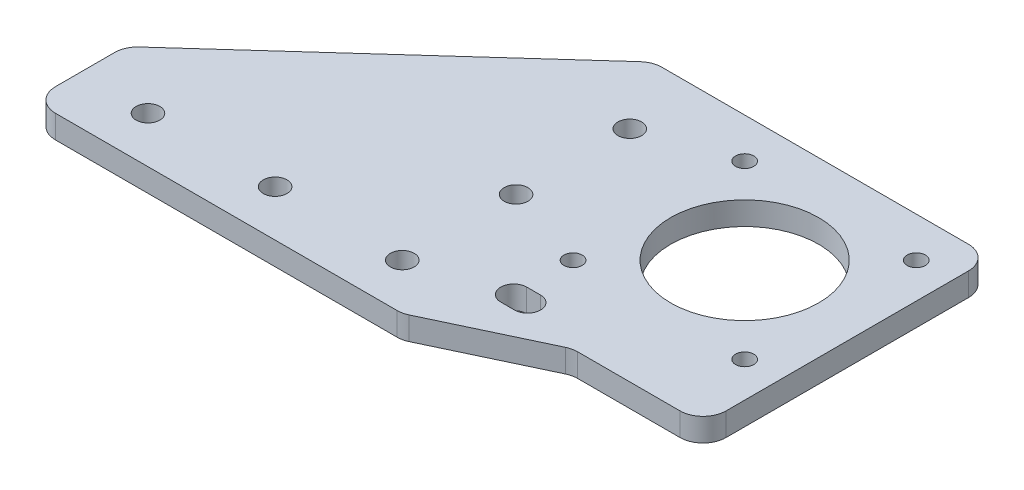
ISO-10303-21;
HEADER;
FILE_DESCRIPTION(('STEP AP214'),'2;1');
FILE_NAME('part.step','',(''),(''),'','','');
FILE_SCHEMA(('AUTOMOTIVE_DESIGN { 1 0 10303 214 1 1 1 1 }'));
ENDSEC;
DATA;
#1=APPLICATION_CONTEXT('core data for automotive mechanical design processes');
#2=APPLICATION_PROTOCOL_DEFINITION('international standard','automotive_design',2000,#1);
#3=PRODUCT_CONTEXT('',#1,'mechanical');
#4=PRODUCT('Part','Part','',(#3));
#5=PRODUCT_RELATED_PRODUCT_CATEGORY('part','',(#4));
#6=PRODUCT_DEFINITION_FORMATION('','',#4);
#7=PRODUCT_DEFINITION_CONTEXT('part definition',#1,'design');
#8=PRODUCT_DEFINITION('design','',#6,#7);
#9=PRODUCT_DEFINITION_SHAPE('','',#8);
#10=(LENGTH_UNIT() NAMED_UNIT(*) SI_UNIT(.MILLI.,.METRE.));
#11=(NAMED_UNIT(*) PLANE_ANGLE_UNIT() SI_UNIT($,.RADIAN.));
#12=(NAMED_UNIT(*) SI_UNIT($,.STERADIAN.) SOLID_ANGLE_UNIT());
#13=UNCERTAINTY_MEASURE_WITH_UNIT(LENGTH_MEASURE(1.E-05),#10,'distance_accuracy_value','');
#14=(GEOMETRIC_REPRESENTATION_CONTEXT(3) GLOBAL_UNCERTAINTY_ASSIGNED_CONTEXT((#13)) GLOBAL_UNIT_ASSIGNED_CONTEXT((#10,
#11,#12)) REPRESENTATION_CONTEXT('',''));
#15=CARTESIAN_POINT('',(0.,0.,0.));
#16=DIRECTION('',(0.,0.,1.));
#17=DIRECTION('',(1.,0.,0.));
#18=AXIS2_PLACEMENT_3D('',#15,#16,#17);
#19=CARTESIAN_POINT('',(825.49984698212,19.0499999999942,901.7));
#20=DIRECTION('',(-0.670362372502047,0.,-0.74203388705195));
#21=DIRECTION('',(-0.74203388705195,0.,0.670362372502047));
#22=AXIS2_PLACEMENT_3D('',#19,#20,#21);
#23=PLANE('',#22);
#24=DIRECTION('',(0.74203388705195,0.,-0.670362372502047));
#25=VECTOR('',#24,1.);
#26=CARTESIAN_POINT('',(825.49984698212,12.6999999999942,901.7));
#27=LINE('',#26,#25);
#28=CARTESIAN_POINT('',(827.593045916732,12.6999999999942,899.808978810254));
#29=VERTEX_POINT('',#28);
#30=CARTESIAN_POINT('',(899.88662700722,12.6999999999937,834.49808481722));
#31=VERTEX_POINT('',#30);
#32=EDGE_CURVE('E205',#29,#31,#27,.T.);
#33=ORIENTED_EDGE('',*,*,#32,.F.);
#34=DIRECTION('',(0.,-1.,0.));
#35=VECTOR('',#34,1.);
#36=CARTESIAN_POINT('',(827.593045916732,19.0499999999942,899.808978810254));
#37=LINE('',#36,#35);
#38=CARTESIAN_POINT('',(827.593045916732,19.0499999999942,899.808978810254));
#39=VERTEX_POINT('',#38);
#40=EDGE_CURVE('E269',#29,#39,#37,.F.);
#41=ORIENTED_EDGE('',*,*,#40,.T.);
#42=DIRECTION('',(0.74203388705195,0.,-0.670362372502047));
#43=VECTOR('',#42,1.);
#44=CARTESIAN_POINT('',(825.49984698212,19.0499999999942,901.7));
#45=LINE('',#44,#43);
#46=CARTESIAN_POINT('',(899.88662700722,19.0499999999937,834.49808481722));
#47=VERTEX_POINT('',#46);
#48=EDGE_CURVE('E209',#39,#47,#45,.T.);
#49=ORIENTED_EDGE('',*,*,#48,.T.);
#50=DIRECTION('',(0.,-1.,0.));
#51=VECTOR('',#50,1.);
#52=CARTESIAN_POINT('',(899.88662700722,19.0499999999937,834.49808481722));
#53=LINE('',#52,#51);
#54=EDGE_CURVE('E266',#47,#31,#53,.T.);
#55=ORIENTED_EDGE('',*,*,#54,.T.);
#56=EDGE_LOOP('',(#33,#41,#49,#55));
#57=FACE_BOUND('',#56,.T.);
#58=ADVANCED_FACE('F34',(#57),#23,.T.);
#59=CARTESIAN_POINT('',(825.49984698212,19.0499999999942,901.7));
#60=DIRECTION('',(-1.,0.,0.));
#61=DIRECTION('',(0.,-1.,0.));
#62=AXIS2_PLACEMENT_3D('',#59,#60,#61);
#63=PLANE('',#62);
#64=DIRECTION('',(0.,0.,-1.));
#65=VECTOR('',#64,1.);
#66=CARTESIAN_POINT('',(825.49984698212,19.0499999999942,901.7));
#67=LINE('',#66,#65);
#68=CARTESIAN_POINT('',(825.49984698212,19.0499999999942,920.75));
#69=VERTEX_POINT('',#68);
#70=CARTESIAN_POINT('',(825.49984698212,19.0499999999942,904.520893993033));
#71=VERTEX_POINT('',#70);
#72=EDGE_CURVE('E227',#69,#71,#67,.T.);
#73=ORIENTED_EDGE('',*,*,#72,.T.);
#74=DIRECTION('',(0.,-1.,0.));
#75=VECTOR('',#74,1.);
#76=CARTESIAN_POINT('',(825.49984698212,19.0499999999942,904.520893993033));
#77=LINE('',#76,#75);
#78=CARTESIAN_POINT('',(825.49984698212,12.6999999999942,904.520893993033));
#79=VERTEX_POINT('',#78);
#80=EDGE_CURVE('E251',#71,#79,#77,.T.);
#81=ORIENTED_EDGE('',*,*,#80,.T.);
#82=DIRECTION('',(0.,0.,-1.));
#83=VECTOR('',#82,1.);
#84=CARTESIAN_POINT('',(825.49984698212,12.6999999999942,901.7));
#85=LINE('',#84,#83);
#86=CARTESIAN_POINT('',(825.49984698212,12.6999999999942,920.75));
#87=VERTEX_POINT('',#86);
#88=EDGE_CURVE('E213',#87,#79,#85,.T.);
#89=ORIENTED_EDGE('',*,*,#88,.F.);
#90=DIRECTION('',(0.,-1.,0.));
#91=VECTOR('',#90,1.);
#92=CARTESIAN_POINT('',(825.49984698212,19.0499999999942,920.75));
#93=LINE('',#92,#91);
#94=EDGE_CURVE('E230',#87,#69,#93,.F.);
#95=ORIENTED_EDGE('',*,*,#94,.T.);
#96=EDGE_LOOP('',(#73,#81,#89,#95));
#97=FACE_BOUND('',#96,.T.);
#98=ADVANCED_FACE('F391',(#97),#63,.T.);
#99=CARTESIAN_POINT('',(825.49984698212,19.0499999999942,927.1));
#100=DIRECTION('',(0.,0.,1.));
#101=DIRECTION('',(1.,0.,0.));
#102=AXIS2_PLACEMENT_3D('',#99,#100,#101);
#103=PLANE('',#102);
#104=DIRECTION('',(-1.,0.,0.));
#105=VECTOR('',#104,1.);
#106=CARTESIAN_POINT('',(901.699846982121,19.0499999999937,927.1));
#107=LINE('',#106,#105);
#108=CARTESIAN_POINT('',(925.677052343548,19.0499999999935,927.1));
#109=VERTEX_POINT('',#108);
#110=CARTESIAN_POINT('',(831.84984698212,19.0499999999942,927.1));
#111=VERTEX_POINT('',#110);
#112=EDGE_CURVE('E224',#109,#111,#107,.T.);
#113=ORIENTED_EDGE('',*,*,#112,.T.);
#114=DIRECTION('',(0.,-1.,0.));
#115=VECTOR('',#114,1.);
#116=CARTESIAN_POINT('',(831.84984698212,19.0499999999942,927.1));
#117=LINE('',#116,#115);
#118=CARTESIAN_POINT('',(831.84984698212,12.6999999999942,927.1));
#119=VERTEX_POINT('',#118);
#120=EDGE_CURVE('E288',#111,#119,#117,.T.);
#121=ORIENTED_EDGE('',*,*,#120,.T.);
#122=DIRECTION('',(-1.,0.,0.));
#123=VECTOR('',#122,1.);
#124=CARTESIAN_POINT('',(825.49984698212,12.6999999999942,927.1));
#125=LINE('',#124,#123);
#126=CARTESIAN_POINT('',(925.677052343548,12.6999999999935,927.1));
#127=VERTEX_POINT('',#126);
#128=EDGE_CURVE('E245',#127,#119,#125,.T.);
#129=ORIENTED_EDGE('',*,*,#128,.F.);
#130=DIRECTION('',(0.,-1.,0.));
#131=VECTOR('',#130,1.);
#132=CARTESIAN_POINT('',(925.677052343548,19.0499999999935,927.1));
#133=LINE('',#132,#131);
#134=EDGE_CURVE('E286',#127,#109,#133,.F.);
#135=ORIENTED_EDGE('',*,*,#134,.T.);
#136=EDGE_LOOP('',(#113,#121,#129,#135));
#137=FACE_BOUND('',#136,.T.);
#138=ADVANCED_FACE('F402',(#137),#103,.T.);
#139=CARTESIAN_POINT('',(927.099846982121,19.0499999999935,927.1));
#140=DIRECTION('',(0.426702203849445,0.,0.904392187731643));
#141=DIRECTION('',(0.904392187731643,0.,-0.426702203849445));
#142=AXIS2_PLACEMENT_3D('',#139,#140,#141);
#143=PLANE('',#142);
#144=DIRECTION('',(-0.904392187731643,0.,0.426702203849445));
#145=VECTOR('',#144,1.);
#146=CARTESIAN_POINT('',(927.099846982121,19.0499999999935,927.1));
#147=LINE('',#146,#145);
#148=CARTESIAN_POINT('',(957.563082626249,19.0499999999933,912.727109607904));
#149=VERTEX_POINT('',#148);
#150=CARTESIAN_POINT('',(928.386611337992,19.0499999999935,926.492890392096));
#151=VERTEX_POINT('',#150);
#152=EDGE_CURVE('E221',#149,#151,#147,.T.);
#153=ORIENTED_EDGE('',*,*,#152,.T.);
#154=DIRECTION('',(0.,-1.,0.));
#155=VECTOR('',#154,1.);
#156=CARTESIAN_POINT('',(928.386611337992,19.0499999999935,926.492890392096));
#157=LINE('',#156,#155);
#158=CARTESIAN_POINT('',(928.386611337992,12.6999999999935,926.492890392096));
#159=VERTEX_POINT('',#158);
#160=EDGE_CURVE('E293',#151,#159,#157,.T.);
#161=ORIENTED_EDGE('',*,*,#160,.T.);
#162=DIRECTION('',(-0.904392187731643,0.,0.426702203849445));
#163=VECTOR('',#162,1.);
#164=CARTESIAN_POINT('',(927.099846982121,12.6999999999935,927.1));
#165=LINE('',#164,#163);
#166=CARTESIAN_POINT('',(957.563082626249,12.6999999999933,912.727109607904));
#167=VERTEX_POINT('',#166);
#168=EDGE_CURVE('E242',#167,#159,#165,.T.);
#169=ORIENTED_EDGE('',*,*,#168,.F.);
#170=DIRECTION('',(0.,-1.,0.));
#171=VECTOR('',#170,1.);
#172=CARTESIAN_POINT('',(957.563082626249,19.0499999999933,912.727109607904));
#173=LINE('',#172,#171);
#174=EDGE_CURVE('E291',#167,#149,#173,.F.);
#175=ORIENTED_EDGE('',*,*,#174,.T.);
#176=EDGE_LOOP('',(#153,#161,#169,#175));
#177=FACE_BOUND('',#176,.T.);
#178=ADVANCED_FACE('F411',(#177),#143,.T.);
#179=CARTESIAN_POINT('',(958.849846982121,19.0499999999933,912.12));
#180=DIRECTION('',(0.,0.,1.));
#181=DIRECTION('',(1.,0.,0.));
#182=AXIS2_PLACEMENT_3D('',#179,#180,#181);
#183=PLANE('',#182);
#184=DIRECTION('',(-1.,0.,0.));
#185=VECTOR('',#184,1.);
#186=CARTESIAN_POINT('',(958.849846982121,12.6999999999933,912.12));
#187=LINE('',#186,#185);
#188=CARTESIAN_POINT('',(988.379846982121,12.6999999999931,912.12));
#189=VERTEX_POINT('',#188);
#190=CARTESIAN_POINT('',(960.272641620693,12.6999999999933,912.12));
#191=VERTEX_POINT('',#190);
#192=EDGE_CURVE('E239',#189,#191,#187,.T.);
#193=ORIENTED_EDGE('',*,*,#192,.F.);
#194=DIRECTION('',(0.,-1.,0.));
#195=VECTOR('',#194,1.);
#196=CARTESIAN_POINT('',(988.379846982121,19.0499999999931,912.12));
#197=LINE('',#196,#195);
#198=CARTESIAN_POINT('',(988.379846982121,19.0499999999931,912.12));
#199=VERTEX_POINT('',#198);
#200=EDGE_CURVE('E304',#189,#199,#197,.F.);
#201=ORIENTED_EDGE('',*,*,#200,.T.);
#202=DIRECTION('',(-1.,0.,0.));
#203=VECTOR('',#202,1.);
#204=CARTESIAN_POINT('',(958.849846982121,19.0499999999933,912.12));
#205=LINE('',#204,#203);
#206=CARTESIAN_POINT('',(960.272641620693,19.0499999999933,912.12));
#207=VERTEX_POINT('',#206);
#208=EDGE_CURVE('E218',#199,#207,#205,.T.);
#209=ORIENTED_EDGE('',*,*,#208,.T.);
#210=DIRECTION('',(0.,-1.,0.));
#211=VECTOR('',#210,1.);
#212=CARTESIAN_POINT('',(960.272641620693,12.6999999999933,912.12));
#213=LINE('',#212,#211);
#214=EDGE_CURVE('E301',#207,#191,#213,.T.);
#215=ORIENTED_EDGE('',*,*,#214,.T.);
#216=EDGE_LOOP('',(#193,#201,#209,#215));
#217=FACE_BOUND('',#216,.T.);
#218=ADVANCED_FACE('F420',(#217),#183,.T.);
#219=CARTESIAN_POINT('',(994.729846982121,19.0499999999931,912.12));
#220=DIRECTION('',(1.,0.,0.));
#221=DIRECTION('',(0.,1.,0.));
#222=AXIS2_PLACEMENT_3D('',#219,#220,#221);
#223=PLANE('',#222);
#224=DIRECTION('',(0.,0.,1.));
#225=VECTOR('',#224,1.);
#226=CARTESIAN_POINT('',(994.729846982121,12.6999999999931,912.12));
#227=LINE('',#226,#225);
#228=CARTESIAN_POINT('',(994.729846982121,12.6999999999931,839.21));
#229=VERTEX_POINT('',#228);
#230=CARTESIAN_POINT('',(994.729846982121,12.6999999999931,905.77));
#231=VERTEX_POINT('',#230);
#232=EDGE_CURVE('E236',#229,#231,#227,.T.);
#233=ORIENTED_EDGE('',*,*,#232,.F.);
#234=DIRECTION('',(0.,-1.,0.));
#235=VECTOR('',#234,1.);
#236=CARTESIAN_POINT('',(994.729846982121,19.0499999999931,839.21));
#237=LINE('',#236,#235);
#238=CARTESIAN_POINT('',(994.729846982121,19.0499999999931,839.21));
#239=VERTEX_POINT('',#238);
#240=EDGE_CURVE('E299',#229,#239,#237,.F.);
#241=ORIENTED_EDGE('',*,*,#240,.T.);
#242=DIRECTION('',(0.,0.,1.));
#243=VECTOR('',#242,1.);
#244=CARTESIAN_POINT('',(994.729846982121,19.0499999999931,912.12));
#245=LINE('',#244,#243);
#246=CARTESIAN_POINT('',(994.729846982121,19.0499999999931,905.77));
#247=VERTEX_POINT('',#246);
#248=EDGE_CURVE('E215',#239,#247,#245,.T.);
#249=ORIENTED_EDGE('',*,*,#248,.T.);
#250=DIRECTION('',(0.,-1.,0.));
#251=VECTOR('',#250,1.);
#252=CARTESIAN_POINT('',(994.729846982121,19.0499999999931,905.77));
#253=LINE('',#252,#251);
#254=EDGE_CURVE('E296',#247,#231,#253,.T.);
#255=ORIENTED_EDGE('',*,*,#254,.T.);
#256=EDGE_LOOP('',(#233,#241,#249,#255));
#257=FACE_BOUND('',#256,.T.);
#258=ADVANCED_FACE('F427',(#257),#223,.T.);
#259=CARTESIAN_POINT('',(927.10015301788,19.0499999999935,832.86));
#260=DIRECTION('',(0.,0.,-1.));
#261=DIRECTION('',(-1.,0.,0.));
#262=AXIS2_PLACEMENT_3D('',#259,#260,#261);
#263=PLANE('',#262);
#264=DIRECTION('',(1.,0.,0.));
#265=VECTOR('',#264,1.);
#266=CARTESIAN_POINT('',(927.10015301788,12.6999999999935,832.86));
#267=LINE('',#266,#265);
#268=CARTESIAN_POINT('',(904.143428072608,12.6999999999937,832.86));
#269=VERTEX_POINT('',#268);
#270=CARTESIAN_POINT('',(988.379846982121,12.6999999999931,832.86));
#271=VERTEX_POINT('',#270);
#272=EDGE_CURVE('E233',#269,#271,#267,.T.);
#273=ORIENTED_EDGE('',*,*,#272,.F.);
#274=DIRECTION('',(0.,-1.,0.));
#275=VECTOR('',#274,1.);
#276=CARTESIAN_POINT('',(904.143428072608,19.0499999999937,832.86));
#277=LINE('',#276,#275);
#278=CARTESIAN_POINT('',(904.143428072608,19.0499999999937,832.86));
#279=VERTEX_POINT('',#278);
#280=EDGE_CURVE('E58',#269,#279,#277,.F.);
#281=ORIENTED_EDGE('',*,*,#280,.T.);
#282=DIRECTION('',(1.,0.,0.));
#283=VECTOR('',#282,1.);
#284=CARTESIAN_POINT('',(901.699846982121,19.0499999999937,832.86));
#285=LINE('',#284,#283);
#286=CARTESIAN_POINT('',(988.379846982121,19.0499999999931,832.86));
#287=VERTEX_POINT('',#286);
#288=EDGE_CURVE('E212',#279,#287,#285,.T.);
#289=ORIENTED_EDGE('',*,*,#288,.T.);
#290=DIRECTION('',(0.,-1.,0.));
#291=VECTOR('',#290,1.);
#292=CARTESIAN_POINT('',(988.379846982121,19.0499999999931,832.86));
#293=LINE('',#292,#291);
#294=EDGE_CURVE('E282',#287,#271,#293,.T.);
#295=ORIENTED_EDGE('',*,*,#294,.T.);
#296=EDGE_LOOP('',(#273,#281,#289,#295));
#297=FACE_BOUND('',#296,.T.);
#298=ADVANCED_FACE('F369',(#297),#263,.T.);
#299=CARTESIAN_POINT('',(1.11022302462516E-13,19.05,0.));
#300=DIRECTION('',(0.,1.,0.));
#301=DIRECTION('',(-1.,0.,0.));
#302=AXIS2_PLACEMENT_3D('',#299,#300,#301);
#303=PLANE('',#302);
#304=CARTESIAN_POINT('',(937.879846982121,19.0499999999942,890.98));
#305=DIRECTION('',(0.,1.,0.));
#306=DIRECTION('',(0.,0.,1.));
#307=AXIS2_PLACEMENT_3D('',#304,#305,#306);
#308=CIRCLE('',#307,2.50000000000002);
#309=CARTESIAN_POINT('',(937.879846982121,19.0499999999942,893.48));
#310=VERTEX_POINT('',#309);
#311=EDGE_CURVE('E348',#310,#310,#308,.T.);
#312=ORIENTED_EDGE('',*,*,#311,.F.);
#313=EDGE_LOOP('',(#312));
#314=FACE_BOUND('',#313,.T.);
#315=CARTESIAN_POINT('',(985.019846982121,19.0499999999942,890.98));
#316=DIRECTION('',(0.,1.,0.));
#317=DIRECTION('',(0.,0.,1.));
#318=AXIS2_PLACEMENT_3D('',#315,#316,#317);
#319=CIRCLE('',#318,2.49999999999992);
#320=CARTESIAN_POINT('',(985.019846982121,19.0499999999942,893.48));
#321=VERTEX_POINT('',#320);
#322=EDGE_CURVE('E338',#321,#321,#319,.T.);
#323=ORIENTED_EDGE('',*,*,#322,.F.);
#324=EDGE_LOOP('',(#323));
#325=FACE_BOUND('',#324,.T.);
#326=CARTESIAN_POINT('',(937.879846982121,19.0499999999942,843.84));
#327=DIRECTION('',(0.,1.,0.));
#328=DIRECTION('',(0.,0.,1.));
#329=AXIS2_PLACEMENT_3D('',#326,#327,#328);
#330=CIRCLE('',#329,2.50000000000002);
#331=CARTESIAN_POINT('',(937.879846982121,19.0499999999942,846.34));
#332=VERTEX_POINT('',#331);
#333=EDGE_CURVE('E335',#332,#332,#330,.T.);
#334=ORIENTED_EDGE('',*,*,#333,.F.);
#335=EDGE_LOOP('',(#334));
#336=FACE_BOUND('',#335,.T.);
#337=CARTESIAN_POINT('',(985.019846982121,19.0499999999942,843.84));
#338=DIRECTION('',(0.,1.,0.));
#339=DIRECTION('',(0.,0.,1.));
#340=AXIS2_PLACEMENT_3D('',#337,#338,#339);
#341=CIRCLE('',#340,2.49999999999992);
#342=CARTESIAN_POINT('',(985.019846982121,19.0499999999942,846.34));
#343=VERTEX_POINT('',#342);
#344=EDGE_CURVE('E332',#343,#343,#341,.T.);
#345=ORIENTED_EDGE('',*,*,#344,.F.);
#346=EDGE_LOOP('',(#345));
#347=FACE_BOUND('',#346,.T.);
#348=CARTESIAN_POINT('',(961.449846982121,19.0499999999942,867.41));
#349=DIRECTION('',(0.,1.,0.));
#350=DIRECTION('',(0.,0.,1.));
#351=AXIS2_PLACEMENT_3D('',#348,#349,#350);
#352=CIRCLE('',#351,20.32);
#353=CARTESIAN_POINT('',(961.449846982121,19.0499999999942,887.73));
#354=VERTEX_POINT('',#353);
#355=EDGE_CURVE('E328',#354,#354,#352,.T.);
#356=ORIENTED_EDGE('',*,*,#355,.F.);
#357=EDGE_LOOP('',(#356));
#358=FACE_BOUND('',#357,.T.);
#359=CARTESIAN_POINT('',(914.4,19.0499999999942,914.4));
#360=DIRECTION('',(0.,1.,0.));
#361=DIRECTION('',(0.,0.,1.));
#362=AXIS2_PLACEMENT_3D('',#359,#360,#361);
#363=CIRCLE('',#362,3.26390000000001);
#364=CARTESIAN_POINT('',(914.4,19.0499999999942,917.6639));
#365=VERTEX_POINT('',#364);
#366=EDGE_CURVE('E324',#365,#365,#363,.T.);
#367=ORIENTED_EDGE('',*,*,#366,.F.);
#368=EDGE_LOOP('',(#367));
#369=FACE_BOUND('',#368,.T.);
#370=CARTESIAN_POINT('',(914.4,19.0499999999942,851.91));
#371=DIRECTION('',(0.,1.,0.));
#372=DIRECTION('',(0.,0.,1.));
#373=AXIS2_PLACEMENT_3D('',#370,#371,#372);
#374=CIRCLE('',#373,3.26390000000001);
#375=CARTESIAN_POINT('',(914.4,19.0499999999942,855.1739));
#376=VERTEX_POINT('',#375);
#377=EDGE_CURVE('E320',#376,#376,#374,.T.);
#378=ORIENTED_EDGE('',*,*,#377,.F.);
#379=EDGE_LOOP('',(#378));
#380=FACE_BOUND('',#379,.T.);
#381=CARTESIAN_POINT('',(914.4,19.0499999999942,883.155));
#382=DIRECTION('',(0.,1.,0.));
#383=DIRECTION('',(0.,0.,1.));
#384=AXIS2_PLACEMENT_3D('',#381,#382,#383);
#385=CIRCLE('',#384,3.26390000000001);
#386=CARTESIAN_POINT('',(914.4,19.0499999999942,886.4189));
#387=VERTEX_POINT('',#386);
#388=EDGE_CURVE('E316',#387,#387,#385,.T.);
#389=ORIENTED_EDGE('',*,*,#388,.F.);
#390=EDGE_LOOP('',(#389));
#391=FACE_BOUND('',#390,.T.);
#392=CARTESIAN_POINT('',(879.47492349106,19.0499999999942,914.4));
#393=DIRECTION('',(0.,1.,0.));
#394=DIRECTION('',(0.,0.,1.));
#395=AXIS2_PLACEMENT_3D('',#392,#393,#394);
#396=CIRCLE('',#395,3.26390000000001);
#397=CARTESIAN_POINT('',(879.47492349106,19.0499999999942,917.6639));
#398=VERTEX_POINT('',#397);
#399=EDGE_CURVE('E312',#398,#398,#396,.T.);
#400=ORIENTED_EDGE('',*,*,#399,.F.);
#401=EDGE_LOOP('',(#400));
#402=FACE_BOUND('',#401,.T.);
#403=CARTESIAN_POINT('',(844.54984698212,19.0499999999942,914.4));
#404=DIRECTION('',(0.,1.,0.));
#405=DIRECTION('',(0.,0.,1.));
#406=AXIS2_PLACEMENT_3D('',#403,#404,#405);
#407=CIRCLE('',#406,3.26390000000001);
#408=CARTESIAN_POINT('',(844.54984698212,19.0499999999942,917.6639));
#409=VERTEX_POINT('',#408);
#410=EDGE_CURVE('E192',#409,#409,#407,.T.);
#411=ORIENTED_EDGE('',*,*,#410,.F.);
#412=EDGE_LOOP('',(#411));
#413=FACE_BOUND('',#412,.T.);
#414=CARTESIAN_POINT('',(937.894846982121,19.0499999999934,907.288));
#415=DIRECTION('',(0.,-1.,0.));
#416=DIRECTION('',(1.,0.,0.));
#417=AXIS2_PLACEMENT_3D('',#414,#415,#416);
#418=CIRCLE('',#417,3.56870000000031);
#419=CARTESIAN_POINT('',(937.894846982121,19.0499999999934,910.856700000001));
#420=VERTEX_POINT('',#419);
#421=CARTESIAN_POINT('',(937.894846982121,19.0499999999934,903.7193));
#422=VERTEX_POINT('',#421);
#423=EDGE_CURVE('E166',#420,#422,#418,.T.);
#424=ORIENTED_EDGE('',*,*,#423,.T.);
#425=DIRECTION('',(1.,0.,0.));
#426=VECTOR('',#425,1.);
#427=CARTESIAN_POINT('',(937.894846982121,19.0499999999934,903.7193));
#428=LINE('',#427,#426);
#429=CARTESIAN_POINT('',(941.704846982121,19.0499999999934,903.7193));
#430=VERTEX_POINT('',#429);
#431=EDGE_CURVE('E178',#422,#430,#428,.T.);
#432=ORIENTED_EDGE('',*,*,#431,.T.);
#433=CARTESIAN_POINT('',(941.704846982121,19.0499999999934,907.288));
#434=DIRECTION('',(0.,-1.,0.));
#435=DIRECTION('',(1.,0.,0.));
#436=AXIS2_PLACEMENT_3D('',#433,#434,#435);
#437=CIRCLE('',#436,3.56870000000031);
#438=CARTESIAN_POINT('',(941.704846982121,19.0499999999934,910.856700000001));
#439=VERTEX_POINT('',#438);
#440=EDGE_CURVE('E182',#430,#439,#437,.T.);
#441=ORIENTED_EDGE('',*,*,#440,.T.);
#442=DIRECTION('',(-1.,0.,0.));
#443=VECTOR('',#442,1.);
#444=CARTESIAN_POINT('',(937.894846982121,19.0499999999934,910.856700000001));
#445=LINE('',#444,#443);
#446=EDGE_CURVE('E174',#439,#420,#445,.T.);
#447=ORIENTED_EDGE('',*,*,#446,.T.);
#448=EDGE_LOOP('',(#424,#432,#441,#447));
#449=FACE_BOUND('',#448,.T.);
#450=ORIENTED_EDGE('',*,*,#48,.F.);
#451=CARTESIAN_POINT('',(831.84984698212,19.0499999999942,904.520893993033));
#452=DIRECTION('',(0.,1.,0.));
#453=DIRECTION('',(-1.,0.,0.));
#454=AXIS2_PLACEMENT_3D('',#451,#452,#453);
#455=CIRCLE('',#454,6.35);
#456=EDGE_CURVE('E280',#39,#71,#455,.T.);
#457=ORIENTED_EDGE('',*,*,#456,.T.);
#458=ORIENTED_EDGE('',*,*,#72,.F.);
#459=CARTESIAN_POINT('',(831.84984698212,19.0499999999942,920.75));
#460=DIRECTION('',(0.,1.,0.));
#461=DIRECTION('',(-1.,0.,0.));
#462=AXIS2_PLACEMENT_3D('',#459,#460,#461);
#463=CIRCLE('',#462,6.35);
#464=EDGE_CURVE('E276',#69,#111,#463,.T.);
#465=ORIENTED_EDGE('',*,*,#464,.T.);
#466=ORIENTED_EDGE('',*,*,#112,.F.);
#467=CARTESIAN_POINT('',(925.677052343548,19.0499999999935,920.75));
#468=DIRECTION('',(0.,1.,0.));
#469=DIRECTION('',(-1.,0.,0.));
#470=AXIS2_PLACEMENT_3D('',#467,#468,#469);
#471=CIRCLE('',#470,6.35);
#472=EDGE_CURVE('E274',#109,#151,#471,.T.);
#473=ORIENTED_EDGE('',*,*,#472,.T.);
#474=ORIENTED_EDGE('',*,*,#152,.F.);
#475=CARTESIAN_POINT('',(960.272641620693,19.0499999999933,918.47));
#476=DIRECTION('',(0.,1.,0.));
#477=DIRECTION('',(-1.,0.,0.));
#478=AXIS2_PLACEMENT_3D('',#475,#476,#477);
#479=CIRCLE('',#478,6.35);
#480=EDGE_CURVE('E11',#149,#207,#479,.F.);
#481=ORIENTED_EDGE('',*,*,#480,.T.);
#482=ORIENTED_EDGE('',*,*,#208,.F.);
#483=CARTESIAN_POINT('',(988.379846982121,19.0499999999931,905.77));
#484=DIRECTION('',(0.,1.,0.));
#485=DIRECTION('',(-1.,0.,0.));
#486=AXIS2_PLACEMENT_3D('',#483,#484,#485);
#487=CIRCLE('',#486,6.35);
#488=EDGE_CURVE('E271',#199,#247,#487,.T.);
#489=ORIENTED_EDGE('',*,*,#488,.T.);
#490=ORIENTED_EDGE('',*,*,#248,.F.);
#491=CARTESIAN_POINT('',(988.379846982121,19.0499999999931,839.21));
#492=DIRECTION('',(0.,1.,0.));
#493=DIRECTION('',(-1.,0.,0.));
#494=AXIS2_PLACEMENT_3D('',#491,#492,#493);
#495=CIRCLE('',#494,6.35);
#496=EDGE_CURVE('E51',#239,#287,#495,.T.);
#497=ORIENTED_EDGE('',*,*,#496,.T.);
#498=ORIENTED_EDGE('',*,*,#288,.F.);
#499=CARTESIAN_POINT('',(904.143428072608,19.0499999999937,839.21));
#500=DIRECTION('',(0.,1.,0.));
#501=DIRECTION('',(-1.,0.,0.));
#502=AXIS2_PLACEMENT_3D('',#499,#500,#501);
#503=CIRCLE('',#502,6.35);
#504=EDGE_CURVE('E278',#279,#47,#503,.T.);
#505=ORIENTED_EDGE('',*,*,#504,.T.);
#506=EDGE_LOOP('',(#450,#457,#458,#465,#466,#473,#474,#481,#482,#489,#490,#497,#498,#505));
#507=FACE_BOUND('',#506,.T.);
#508=ADVANCED_FACE('F184',(#314,#325,#336,#347,#358,#369,#380,#391,#402,#413,#449,#507),#303,.T.);
#509=CARTESIAN_POINT('',(1.11022302462516E-13,12.7,0.));
#510=DIRECTION('',(0.,1.,0.));
#511=DIRECTION('',(-1.,0.,0.));
#512=AXIS2_PLACEMENT_3D('',#509,#510,#511);
#513=PLANE('',#512);
#514=CARTESIAN_POINT('',(937.879846982121,12.6999999999935,890.98));
#515=DIRECTION('',(0.,1.,0.));
#516=DIRECTION('',(-1.,0.,0.));
#517=AXIS2_PLACEMENT_3D('',#514,#515,#516);
#518=CIRCLE('',#517,2.50000000000002);
#519=CARTESIAN_POINT('',(935.379846982121,12.6999999999935,890.98));
#520=VERTEX_POINT('',#519);
#521=EDGE_CURVE('E38',#520,#520,#518,.F.);
#522=ORIENTED_EDGE('',*,*,#521,.F.);
#523=EDGE_LOOP('',(#522));
#524=FACE_BOUND('',#523,.T.);
#525=CARTESIAN_POINT('',(985.019846982121,12.6999999999931,890.98));
#526=DIRECTION('',(0.,1.,0.));
#527=DIRECTION('',(-1.,0.,0.));
#528=AXIS2_PLACEMENT_3D('',#525,#526,#527);
#529=CIRCLE('',#528,2.49999999999992);
#530=CARTESIAN_POINT('',(982.519846982121,12.6999999999931,890.98));
#531=VERTEX_POINT('',#530);
#532=EDGE_CURVE('E336',#531,#531,#529,.F.);
#533=ORIENTED_EDGE('',*,*,#532,.F.);
#534=EDGE_LOOP('',(#533));
#535=FACE_BOUND('',#534,.T.);
#536=CARTESIAN_POINT('',(937.879846982121,12.6999999999935,843.84));
#537=DIRECTION('',(0.,1.,0.));
#538=DIRECTION('',(-1.,0.,0.));
#539=AXIS2_PLACEMENT_3D('',#536,#537,#538);
#540=CIRCLE('',#539,2.50000000000002);
#541=CARTESIAN_POINT('',(935.379846982121,12.6999999999935,843.84));
#542=VERTEX_POINT('',#541);
#543=EDGE_CURVE('E333',#542,#542,#540,.F.);
#544=ORIENTED_EDGE('',*,*,#543,.F.);
#545=EDGE_LOOP('',(#544));
#546=FACE_BOUND('',#545,.T.);
#547=CARTESIAN_POINT('',(985.019846982121,12.6999999999931,843.84));
#548=DIRECTION('',(0.,1.,0.));
#549=DIRECTION('',(-1.,0.,0.));
#550=AXIS2_PLACEMENT_3D('',#547,#548,#549);
#551=CIRCLE('',#550,2.49999999999992);
#552=CARTESIAN_POINT('',(982.519846982121,12.6999999999931,843.84));
#553=VERTEX_POINT('',#552);
#554=EDGE_CURVE('E329',#553,#553,#551,.F.);
#555=ORIENTED_EDGE('',*,*,#554,.F.);
#556=EDGE_LOOP('',(#555));
#557=FACE_BOUND('',#556,.T.);
#558=CARTESIAN_POINT('',(961.449846982121,12.6999999999933,867.41));
#559=DIRECTION('',(0.,1.,0.));
#560=DIRECTION('',(-1.,0.,0.));
#561=AXIS2_PLACEMENT_3D('',#558,#559,#560);
#562=CIRCLE('',#561,20.32);
#563=CARTESIAN_POINT('',(941.129846982121,12.6999999999934,867.41));
#564=VERTEX_POINT('',#563);
#565=EDGE_CURVE('E325',#564,#564,#562,.F.);
#566=ORIENTED_EDGE('',*,*,#565,.F.);
#567=EDGE_LOOP('',(#566));
#568=FACE_BOUND('',#567,.T.);
#569=CARTESIAN_POINT('',(914.4,12.6999999999936,914.4));
#570=DIRECTION('',(0.,1.,0.));
#571=DIRECTION('',(-1.,0.,0.));
#572=AXIS2_PLACEMENT_3D('',#569,#570,#571);
#573=CIRCLE('',#572,3.26390000000001);
#574=CARTESIAN_POINT('',(911.1361,12.6999999999936,914.4));
#575=VERTEX_POINT('',#574);
#576=EDGE_CURVE('E321',#575,#575,#573,.F.);
#577=ORIENTED_EDGE('',*,*,#576,.F.);
#578=EDGE_LOOP('',(#577));
#579=FACE_BOUND('',#578,.T.);
#580=CARTESIAN_POINT('',(914.4,12.6999999999936,851.91));
#581=DIRECTION('',(0.,1.,0.));
#582=DIRECTION('',(-1.,0.,0.));
#583=AXIS2_PLACEMENT_3D('',#580,#581,#582);
#584=CIRCLE('',#583,3.26390000000001);
#585=CARTESIAN_POINT('',(911.1361,12.6999999999936,851.91));
#586=VERTEX_POINT('',#585);
#587=EDGE_CURVE('E317',#586,#586,#584,.F.);
#588=ORIENTED_EDGE('',*,*,#587,.F.);
#589=EDGE_LOOP('',(#588));
#590=FACE_BOUND('',#589,.T.);
#591=CARTESIAN_POINT('',(914.4,12.6999999999936,883.155));
#592=DIRECTION('',(0.,1.,0.));
#593=DIRECTION('',(-1.,0.,0.));
#594=AXIS2_PLACEMENT_3D('',#591,#592,#593);
#595=CIRCLE('',#594,3.26390000000001);
#596=CARTESIAN_POINT('',(911.1361,12.6999999999936,883.155));
#597=VERTEX_POINT('',#596);
#598=EDGE_CURVE('E313',#597,#597,#595,.F.);
#599=ORIENTED_EDGE('',*,*,#598,.F.);
#600=EDGE_LOOP('',(#599));
#601=FACE_BOUND('',#600,.T.);
#602=CARTESIAN_POINT('',(879.47492349106,12.6999999999939,914.4));
#603=DIRECTION('',(0.,1.,0.));
#604=DIRECTION('',(-1.,0.,0.));
#605=AXIS2_PLACEMENT_3D('',#602,#603,#604);
#606=CIRCLE('',#605,3.26390000000001);
#607=CARTESIAN_POINT('',(876.21102349106,12.6999999999939,914.4));
#608=VERTEX_POINT('',#607);
#609=EDGE_CURVE('E309',#608,#608,#606,.F.);
#610=ORIENTED_EDGE('',*,*,#609,.F.);
#611=EDGE_LOOP('',(#610));
#612=FACE_BOUND('',#611,.T.);
#613=CARTESIAN_POINT('',(844.54984698212,12.6999999999941,914.4));
#614=DIRECTION('',(0.,1.,0.));
#615=DIRECTION('',(-1.,0.,0.));
#616=AXIS2_PLACEMENT_3D('',#613,#614,#615);
#617=CIRCLE('',#616,3.26390000000001);
#618=CARTESIAN_POINT('',(841.28594698212,12.6999999999941,914.4));
#619=VERTEX_POINT('',#618);
#620=EDGE_CURVE('E199',#619,#619,#617,.F.);
#621=ORIENTED_EDGE('',*,*,#620,.F.);
#622=EDGE_LOOP('',(#621));
#623=FACE_BOUND('',#622,.T.);
#624=DIRECTION('',(1.,0.,0.));
#625=VECTOR('',#624,1.);
#626=CARTESIAN_POINT('',(937.894846982121,12.6999999999935,903.7193));
#627=LINE('',#626,#625);
#628=CARTESIAN_POINT('',(937.894846982121,12.6999999999935,903.7193));
#629=VERTEX_POINT('',#628);
#630=CARTESIAN_POINT('',(941.704846982121,12.6999999999934,903.7193));
#631=VERTEX_POINT('',#630);
#632=EDGE_CURVE('E198',#629,#631,#627,.T.);
#633=ORIENTED_EDGE('',*,*,#632,.F.);
#634=CARTESIAN_POINT('',(937.894846982121,12.6999999999935,907.288));
#635=DIRECTION('',(0.,-1.,0.));
#636=DIRECTION('',(1.,0.,0.));
#637=AXIS2_PLACEMENT_3D('',#634,#635,#636);
#638=CIRCLE('',#637,3.56870000000031);
#639=CARTESIAN_POINT('',(937.894846982121,12.6999999999935,910.856700000001));
#640=VERTEX_POINT('',#639);
#641=EDGE_CURVE('E169',#640,#629,#638,.T.);
#642=ORIENTED_EDGE('',*,*,#641,.F.);
#643=DIRECTION('',(-1.,0.,0.));
#644=VECTOR('',#643,1.);
#645=CARTESIAN_POINT('',(937.894846982121,12.6999999999935,910.856700000001));
#646=LINE('',#645,#644);
#647=CARTESIAN_POINT('',(941.704846982121,12.6999999999934,910.856700000001));
#648=VERTEX_POINT('',#647);
#649=EDGE_CURVE('E186',#648,#640,#646,.T.);
#650=ORIENTED_EDGE('',*,*,#649,.F.);
#651=CARTESIAN_POINT('',(941.704846982121,12.6999999999934,907.288));
#652=DIRECTION('',(0.,-1.,0.));
#653=DIRECTION('',(1.,0.,0.));
#654=AXIS2_PLACEMENT_3D('',#651,#652,#653);
#655=CIRCLE('',#654,3.56870000000031);
#656=EDGE_CURVE('E189',#631,#648,#655,.T.);
#657=ORIENTED_EDGE('',*,*,#656,.F.);
#658=EDGE_LOOP('',(#633,#642,#650,#657));
#659=FACE_BOUND('',#658,.T.);
#660=ORIENTED_EDGE('',*,*,#88,.T.);
#661=CARTESIAN_POINT('',(831.84984698212,12.6999999999942,904.520893993033));
#662=DIRECTION('',(0.,1.,0.));
#663=DIRECTION('',(-1.,0.,0.));
#664=AXIS2_PLACEMENT_3D('',#661,#662,#663);
#665=CIRCLE('',#664,6.35);
#666=EDGE_CURVE('E264',#79,#29,#665,.F.);
#667=ORIENTED_EDGE('',*,*,#666,.T.);
#668=ORIENTED_EDGE('',*,*,#32,.T.);
#669=CARTESIAN_POINT('',(904.143428072608,12.6999999999937,839.21));
#670=DIRECTION('',(0.,1.,0.));
#671=DIRECTION('',(-1.,0.,0.));
#672=AXIS2_PLACEMENT_3D('',#669,#670,#671);
#673=CIRCLE('',#672,6.35);
#674=EDGE_CURVE('E262',#31,#269,#673,.F.);
#675=ORIENTED_EDGE('',*,*,#674,.T.);
#676=ORIENTED_EDGE('',*,*,#272,.T.);
#677=CARTESIAN_POINT('',(988.379846982121,12.6999999999931,839.21));
#678=DIRECTION('',(0.,1.,0.));
#679=DIRECTION('',(-1.,0.,0.));
#680=AXIS2_PLACEMENT_3D('',#677,#678,#679);
#681=CIRCLE('',#680,6.35);
#682=EDGE_CURVE('E256',#271,#229,#681,.F.);
#683=ORIENTED_EDGE('',*,*,#682,.T.);
#684=ORIENTED_EDGE('',*,*,#232,.T.);
#685=CARTESIAN_POINT('',(988.379846982121,12.6999999999931,905.77));
#686=DIRECTION('',(0.,1.,0.));
#687=DIRECTION('',(-1.,0.,0.));
#688=AXIS2_PLACEMENT_3D('',#685,#686,#687);
#689=CIRCLE('',#688,6.35);
#690=EDGE_CURVE('E254',#231,#189,#689,.F.);
#691=ORIENTED_EDGE('',*,*,#690,.T.);
#692=ORIENTED_EDGE('',*,*,#192,.T.);
#693=CARTESIAN_POINT('',(960.272641620693,12.6999999999933,918.47));
#694=DIRECTION('',(0.,1.,0.));
#695=DIRECTION('',(-1.,0.,0.));
#696=AXIS2_PLACEMENT_3D('',#693,#694,#695);
#697=CIRCLE('',#696,6.35);
#698=EDGE_CURVE('E43',#191,#167,#697,.T.);
#699=ORIENTED_EDGE('',*,*,#698,.T.);
#700=ORIENTED_EDGE('',*,*,#168,.T.);
#701=CARTESIAN_POINT('',(925.677052343548,12.6999999999935,920.75));
#702=DIRECTION('',(0.,1.,0.));
#703=DIRECTION('',(-1.,0.,0.));
#704=AXIS2_PLACEMENT_3D('',#701,#702,#703);
#705=CIRCLE('',#704,6.35);
#706=EDGE_CURVE('E258',#159,#127,#705,.F.);
#707=ORIENTED_EDGE('',*,*,#706,.T.);
#708=ORIENTED_EDGE('',*,*,#128,.T.);
#709=CARTESIAN_POINT('',(831.84984698212,12.6999999999942,920.75));
#710=DIRECTION('',(0.,1.,0.));
#711=DIRECTION('',(-1.,0.,0.));
#712=AXIS2_PLACEMENT_3D('',#709,#710,#711);
#713=CIRCLE('',#712,6.35);
#714=EDGE_CURVE('E260',#119,#87,#713,.F.);
#715=ORIENTED_EDGE('',*,*,#714,.T.);
#716=EDGE_LOOP('',(#660,#667,#668,#675,#676,#683,#684,#691,#692,#699,#700,#707,#708,#715));
#717=FACE_BOUND('',#716,.T.);
#718=ADVANCED_FACE('F368',(#524,#535,#546,#557,#568,#579,#590,#601,#612,#623,#659,#717),#513,.F.);
#719=CARTESIAN_POINT('',(937.894846982121,19.0499999999934,907.288));
#720=DIRECTION('',(0.,-1.,0.));
#721=DIRECTION('',(1.,0.,0.));
#722=AXIS2_PLACEMENT_3D('',#719,#720,#721);
#723=CYLINDRICAL_SURFACE('',#722,3.56870000000031);
#724=ORIENTED_EDGE('',*,*,#641,.T.);
#725=DIRECTION('',(0.,-1.,0.));
#726=VECTOR('',#725,1.);
#727=CARTESIAN_POINT('',(937.894846982121,19.0499999999934,903.7193));
#728=LINE('',#727,#726);
#729=EDGE_CURVE('E162',#422,#629,#728,.T.);
#730=ORIENTED_EDGE('',*,*,#729,.F.);
#731=ORIENTED_EDGE('',*,*,#423,.F.);
#732=DIRECTION('',(0.,-1.,0.));
#733=VECTOR('',#732,1.);
#734=CARTESIAN_POINT('',(937.894846982121,19.0499999999934,910.856700000001));
#735=LINE('',#734,#733);
#736=EDGE_CURVE('E203',#420,#640,#735,.T.);
#737=ORIENTED_EDGE('',*,*,#736,.T.);
#738=EDGE_LOOP('',(#724,#730,#731,#737));
#739=FACE_BOUND('',#738,.T.);
#740=ADVANCED_FACE('F164',(#739),#723,.F.);
#741=CARTESIAN_POINT('',(937.894846982121,19.0499999999934,910.856700000001));
#742=DIRECTION('',(0.,0.,1.));
#743=DIRECTION('',(1.,0.,0.));
#744=AXIS2_PLACEMENT_3D('',#741,#742,#743);
#745=PLANE('',#744);
#746=ORIENTED_EDGE('',*,*,#649,.T.);
#747=ORIENTED_EDGE('',*,*,#736,.F.);
#748=ORIENTED_EDGE('',*,*,#446,.F.);
#749=DIRECTION('',(0.,-1.,0.));
#750=VECTOR('',#749,1.);
#751=CARTESIAN_POINT('',(941.704846982121,19.0499999999934,910.856700000001));
#752=LINE('',#751,#750);
#753=EDGE_CURVE('E206',#439,#648,#752,.T.);
#754=ORIENTED_EDGE('',*,*,#753,.T.);
#755=EDGE_LOOP('',(#746,#747,#748,#754));
#756=FACE_BOUND('',#755,.T.);
#757=ADVANCED_FACE('F468',(#756),#745,.F.);
#758=CARTESIAN_POINT('',(941.704846982121,19.0499999999934,907.288));
#759=DIRECTION('',(0.,-1.,0.));
#760=DIRECTION('',(1.,0.,0.));
#761=AXIS2_PLACEMENT_3D('',#758,#759,#760);
#762=CYLINDRICAL_SURFACE('',#761,3.56870000000031);
#763=ORIENTED_EDGE('',*,*,#656,.T.);
#764=ORIENTED_EDGE('',*,*,#753,.F.);
#765=ORIENTED_EDGE('',*,*,#440,.F.);
#766=DIRECTION('',(0.,-1.,0.));
#767=VECTOR('',#766,1.);
#768=CARTESIAN_POINT('',(941.704846982121,19.0499999999934,903.7193));
#769=LINE('',#768,#767);
#770=EDGE_CURVE('E173',#430,#631,#769,.T.);
#771=ORIENTED_EDGE('',*,*,#770,.T.);
#772=EDGE_LOOP('',(#763,#764,#765,#771));
#773=FACE_BOUND('',#772,.T.);
#774=ADVANCED_FACE('F448',(#773),#762,.F.);
#775=CARTESIAN_POINT('',(937.894846982121,19.0499999999934,903.7193));
#776=DIRECTION('',(0.,0.,-1.));
#777=DIRECTION('',(-1.,0.,0.));
#778=AXIS2_PLACEMENT_3D('',#775,#776,#777);
#779=PLANE('',#778);
#780=ORIENTED_EDGE('',*,*,#632,.T.);
#781=ORIENTED_EDGE('',*,*,#770,.F.);
#782=ORIENTED_EDGE('',*,*,#431,.F.);
#783=ORIENTED_EDGE('',*,*,#729,.T.);
#784=EDGE_LOOP('',(#780,#781,#782,#783));
#785=FACE_BOUND('',#784,.T.);
#786=ADVANCED_FACE('F179',(#785),#779,.F.);
#787=CARTESIAN_POINT('',(831.84984698212,19.0499999999942,904.520893993033));
#788=DIRECTION('',(0.,-1.,0.));
#789=DIRECTION('',(1.,0.,0.));
#790=AXIS2_PLACEMENT_3D('',#787,#788,#789);
#791=CYLINDRICAL_SURFACE('',#790,6.35);
#792=ORIENTED_EDGE('',*,*,#456,.F.);
#793=ORIENTED_EDGE('',*,*,#40,.F.);
#794=ORIENTED_EDGE('',*,*,#666,.F.);
#795=ORIENTED_EDGE('',*,*,#80,.F.);
#796=EDGE_LOOP('',(#792,#793,#794,#795));
#797=FACE_BOUND('',#796,.T.);
#798=ADVANCED_FACE('F440',(#797),#791,.T.);
#799=CARTESIAN_POINT('',(904.143428072608,19.0499999999937,839.21));
#800=DIRECTION('',(0.,-1.,0.));
#801=DIRECTION('',(1.,0.,0.));
#802=AXIS2_PLACEMENT_3D('',#799,#800,#801);
#803=CYLINDRICAL_SURFACE('',#802,6.35);
#804=ORIENTED_EDGE('',*,*,#504,.F.);
#805=ORIENTED_EDGE('',*,*,#280,.F.);
#806=ORIENTED_EDGE('',*,*,#674,.F.);
#807=ORIENTED_EDGE('',*,*,#54,.F.);
#808=EDGE_LOOP('',(#804,#805,#806,#807));
#809=FACE_BOUND('',#808,.T.);
#810=ADVANCED_FACE('F435',(#809),#803,.T.);
#811=CARTESIAN_POINT('',(831.84984698212,19.0499999999942,920.75));
#812=DIRECTION('',(0.,-1.,0.));
#813=DIRECTION('',(1.,0.,0.));
#814=AXIS2_PLACEMENT_3D('',#811,#812,#813);
#815=CYLINDRICAL_SURFACE('',#814,6.35);
#816=ORIENTED_EDGE('',*,*,#464,.F.);
#817=ORIENTED_EDGE('',*,*,#94,.F.);
#818=ORIENTED_EDGE('',*,*,#714,.F.);
#819=ORIENTED_EDGE('',*,*,#120,.F.);
#820=EDGE_LOOP('',(#816,#817,#818,#819));
#821=FACE_BOUND('',#820,.T.);
#822=ADVANCED_FACE('F396',(#821),#815,.T.);
#823=CARTESIAN_POINT('',(925.677052343548,19.0499999999935,920.75));
#824=DIRECTION('',(0.,-1.,0.));
#825=DIRECTION('',(1.,0.,0.));
#826=AXIS2_PLACEMENT_3D('',#823,#824,#825);
#827=CYLINDRICAL_SURFACE('',#826,6.35);
#828=ORIENTED_EDGE('',*,*,#472,.F.);
#829=ORIENTED_EDGE('',*,*,#134,.F.);
#830=ORIENTED_EDGE('',*,*,#706,.F.);
#831=ORIENTED_EDGE('',*,*,#160,.F.);
#832=EDGE_LOOP('',(#828,#829,#830,#831));
#833=FACE_BOUND('',#832,.T.);
#834=ADVANCED_FACE('F406',(#833),#827,.T.);
#835=CARTESIAN_POINT('',(988.379846982121,19.0499999999931,839.21));
#836=DIRECTION('',(0.,-1.,0.));
#837=DIRECTION('',(1.,0.,0.));
#838=AXIS2_PLACEMENT_3D('',#835,#836,#837);
#839=CYLINDRICAL_SURFACE('',#838,6.35);
#840=ORIENTED_EDGE('',*,*,#496,.F.);
#841=ORIENTED_EDGE('',*,*,#240,.F.);
#842=ORIENTED_EDGE('',*,*,#682,.F.);
#843=ORIENTED_EDGE('',*,*,#294,.F.);
#844=EDGE_LOOP('',(#840,#841,#842,#843));
#845=FACE_BOUND('',#844,.T.);
#846=ADVANCED_FACE('F430',(#845),#839,.T.);
#847=CARTESIAN_POINT('',(988.379846982121,19.0499999999931,905.77));
#848=DIRECTION('',(0.,-1.,0.));
#849=DIRECTION('',(1.,0.,0.));
#850=AXIS2_PLACEMENT_3D('',#847,#848,#849);
#851=CYLINDRICAL_SURFACE('',#850,6.35);
#852=ORIENTED_EDGE('',*,*,#488,.F.);
#853=ORIENTED_EDGE('',*,*,#200,.F.);
#854=ORIENTED_EDGE('',*,*,#690,.F.);
#855=ORIENTED_EDGE('',*,*,#254,.F.);
#856=EDGE_LOOP('',(#852,#853,#854,#855));
#857=FACE_BOUND('',#856,.T.);
#858=ADVANCED_FACE('F423',(#857),#851,.T.);
#859=CARTESIAN_POINT('',(960.272641620693,19.0499999999933,918.47));
#860=DIRECTION('',(0.,1.,0.));
#861=DIRECTION('',(-1.,0.,0.));
#862=AXIS2_PLACEMENT_3D('',#859,#860,#861);
#863=CYLINDRICAL_SURFACE('',#862,6.35);
#864=ORIENTED_EDGE('',*,*,#480,.F.);
#865=ORIENTED_EDGE('',*,*,#174,.F.);
#866=ORIENTED_EDGE('',*,*,#698,.F.);
#867=ORIENTED_EDGE('',*,*,#214,.F.);
#868=EDGE_LOOP('',(#864,#865,#866,#867));
#869=FACE_BOUND('',#868,.T.);
#870=ADVANCED_FACE('F36',(#869),#863,.F.);
#871=CARTESIAN_POINT('',(844.54984698212,19.0499999999942,914.4));
#872=DIRECTION('',(0.,-1.,0.));
#873=DIRECTION('',(0.,0.,-1.));
#874=AXIS2_PLACEMENT_3D('',#871,#872,#873);
#875=CYLINDRICAL_SURFACE('',#874,3.26390000000001);
#876=ORIENTED_EDGE('',*,*,#410,.T.);
#877=EDGE_LOOP('',(#876));
#878=FACE_BOUND('',#877,.T.);
#879=ORIENTED_EDGE('',*,*,#620,.T.);
#880=EDGE_LOOP('',(#879));
#881=FACE_BOUND('',#880,.T.);
#882=ADVANCED_FACE('F375',(#878,#881),#875,.F.);
#883=CARTESIAN_POINT('',(879.47492349106,19.0499999999942,914.4));
#884=DIRECTION('',(0.,-1.,0.));
#885=DIRECTION('',(0.,0.,-1.));
#886=AXIS2_PLACEMENT_3D('',#883,#884,#885);
#887=CYLINDRICAL_SURFACE('',#886,3.26390000000001);
#888=ORIENTED_EDGE('',*,*,#399,.T.);
#889=EDGE_LOOP('',(#888));
#890=FACE_BOUND('',#889,.T.);
#891=ORIENTED_EDGE('',*,*,#609,.T.);
#892=EDGE_LOOP('',(#891));
#893=FACE_BOUND('',#892,.T.);
#894=ADVANCED_FACE('F363',(#890,#893),#887,.F.);
#895=CARTESIAN_POINT('',(914.4,19.0499999999942,883.155));
#896=DIRECTION('',(0.,-1.,0.));
#897=DIRECTION('',(0.,0.,-1.));
#898=AXIS2_PLACEMENT_3D('',#895,#896,#897);
#899=CYLINDRICAL_SURFACE('',#898,3.26390000000001);
#900=ORIENTED_EDGE('',*,*,#388,.T.);
#901=EDGE_LOOP('',(#900));
#902=FACE_BOUND('',#901,.T.);
#903=ORIENTED_EDGE('',*,*,#598,.T.);
#904=EDGE_LOOP('',(#903));
#905=FACE_BOUND('',#904,.T.);
#906=ADVANCED_FACE('F478',(#902,#905),#899,.F.);
#907=CARTESIAN_POINT('',(914.4,19.0499999999942,851.91));
#908=DIRECTION('',(0.,-1.,0.));
#909=DIRECTION('',(0.,0.,-1.));
#910=AXIS2_PLACEMENT_3D('',#907,#908,#909);
#911=CYLINDRICAL_SURFACE('',#910,3.26390000000001);
#912=ORIENTED_EDGE('',*,*,#377,.T.);
#913=EDGE_LOOP('',(#912));
#914=FACE_BOUND('',#913,.T.);
#915=ORIENTED_EDGE('',*,*,#587,.T.);
#916=EDGE_LOOP('',(#915));
#917=FACE_BOUND('',#916,.T.);
#918=ADVANCED_FACE('F481',(#914,#917),#911,.F.);
#919=CARTESIAN_POINT('',(914.4,19.0499999999942,914.4));
#920=DIRECTION('',(0.,-1.,0.));
#921=DIRECTION('',(0.,0.,-1.));
#922=AXIS2_PLACEMENT_3D('',#919,#920,#921);
#923=CYLINDRICAL_SURFACE('',#922,3.26390000000001);
#924=ORIENTED_EDGE('',*,*,#366,.T.);
#925=EDGE_LOOP('',(#924));
#926=FACE_BOUND('',#925,.T.);
#927=ORIENTED_EDGE('',*,*,#576,.T.);
#928=EDGE_LOOP('',(#927));
#929=FACE_BOUND('',#928,.T.);
#930=ADVANCED_FACE('F485',(#926,#929),#923,.F.);
#931=CARTESIAN_POINT('',(961.449846982121,19.0499999999942,867.41));
#932=DIRECTION('',(0.,-1.,0.));
#933=DIRECTION('',(0.,0.,-1.));
#934=AXIS2_PLACEMENT_3D('',#931,#932,#933);
#935=CYLINDRICAL_SURFACE('',#934,20.32);
#936=ORIENTED_EDGE('',*,*,#355,.T.);
#937=EDGE_LOOP('',(#936));
#938=FACE_BOUND('',#937,.T.);
#939=ORIENTED_EDGE('',*,*,#565,.T.);
#940=EDGE_LOOP('',(#939));
#941=FACE_BOUND('',#940,.T.);
#942=ADVANCED_FACE('F489',(#938,#941),#935,.F.);
#943=CARTESIAN_POINT('',(985.019846982121,19.0499999999942,843.84));
#944=DIRECTION('',(0.,-1.,0.));
#945=DIRECTION('',(0.,0.,-1.));
#946=AXIS2_PLACEMENT_3D('',#943,#944,#945);
#947=CYLINDRICAL_SURFACE('',#946,2.49999999999992);
#948=ORIENTED_EDGE('',*,*,#344,.T.);
#949=EDGE_LOOP('',(#948));
#950=FACE_BOUND('',#949,.T.);
#951=ORIENTED_EDGE('',*,*,#554,.T.);
#952=EDGE_LOOP('',(#951));
#953=FACE_BOUND('',#952,.T.);
#954=ADVANCED_FACE('F493',(#950,#953),#947,.F.);
#955=CARTESIAN_POINT('',(937.879846982121,19.0499999999942,843.84));
#956=DIRECTION('',(0.,-1.,0.));
#957=DIRECTION('',(0.,0.,-1.));
#958=AXIS2_PLACEMENT_3D('',#955,#956,#957);
#959=CYLINDRICAL_SURFACE('',#958,2.50000000000002);
#960=ORIENTED_EDGE('',*,*,#333,.T.);
#961=EDGE_LOOP('',(#960));
#962=FACE_BOUND('',#961,.T.);
#963=ORIENTED_EDGE('',*,*,#543,.T.);
#964=EDGE_LOOP('',(#963));
#965=FACE_BOUND('',#964,.T.);
#966=ADVANCED_FACE('F497',(#962,#965),#959,.F.);
#967=CARTESIAN_POINT('',(985.019846982121,19.0499999999942,890.98));
#968=DIRECTION('',(0.,-1.,0.));
#969=DIRECTION('',(0.,0.,-1.));
#970=AXIS2_PLACEMENT_3D('',#967,#968,#969);
#971=CYLINDRICAL_SURFACE('',#970,2.49999999999992);
#972=ORIENTED_EDGE('',*,*,#322,.T.);
#973=EDGE_LOOP('',(#972));
#974=FACE_BOUND('',#973,.T.);
#975=ORIENTED_EDGE('',*,*,#532,.T.);
#976=EDGE_LOOP('',(#975));
#977=FACE_BOUND('',#976,.T.);
#978=ADVANCED_FACE('F501',(#974,#977),#971,.F.);
#979=CARTESIAN_POINT('',(937.879846982121,19.0499999999942,890.98));
#980=DIRECTION('',(0.,-1.,0.));
#981=DIRECTION('',(0.,0.,-1.));
#982=AXIS2_PLACEMENT_3D('',#979,#980,#981);
#983=CYLINDRICAL_SURFACE('',#982,2.50000000000002);
#984=ORIENTED_EDGE('',*,*,#311,.T.);
#985=EDGE_LOOP('',(#984));
#986=FACE_BOUND('',#985,.T.);
#987=ORIENTED_EDGE('',*,*,#521,.T.);
#988=EDGE_LOOP('',(#987));
#989=FACE_BOUND('',#988,.T.);
#990=ADVANCED_FACE('F505',(#986,#989),#983,.F.);
#991=CLOSED_SHELL('',(#58,#98,#138,#178,#218,#258,#298,#508,#718,#740,#757,#774,#786,#798,#810,
#822,#834,#846,#858,#870,#882,#894,#906,#918,#930,#942,#954,#966,#978,#990));
#992=MANIFOLD_SOLID_BREP('B2',#991);
#993=ADVANCED_BREP_SHAPE_REPRESENTATION('',(#18,#992),#14);
#994=SHAPE_DEFINITION_REPRESENTATION(#9,#993);
ENDSEC;
END-ISO-10303-21;
